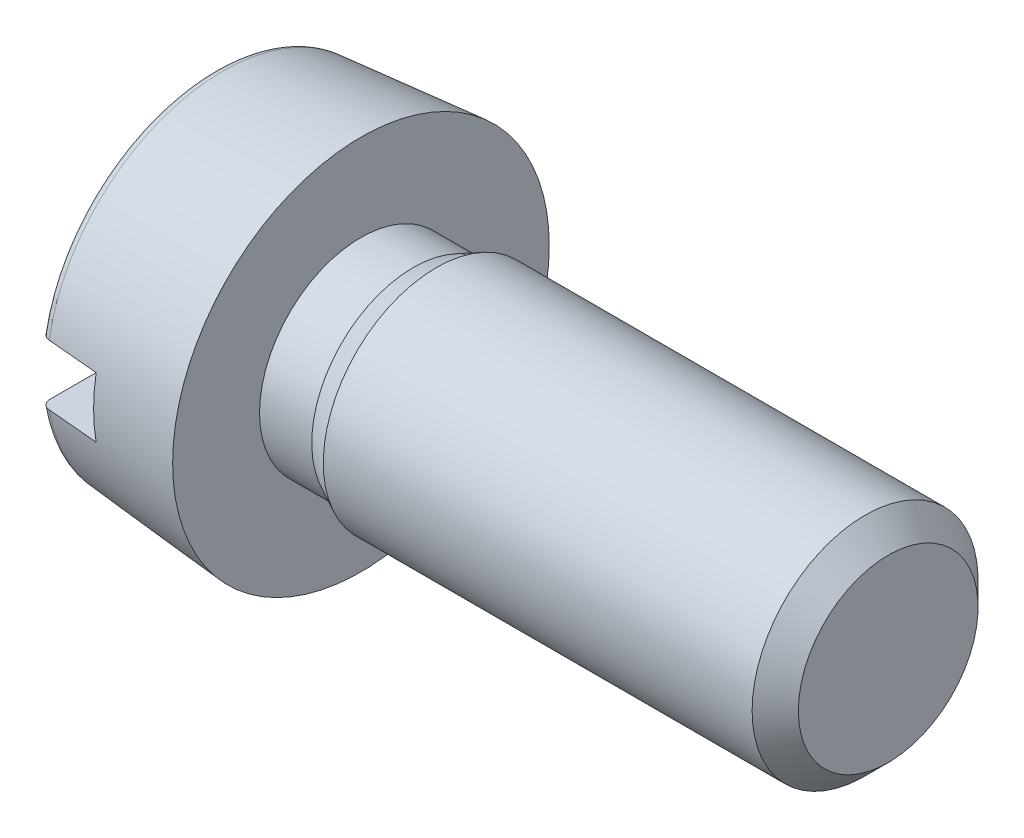
ISO-10303-21;
HEADER;
FILE_DESCRIPTION(('STEP AP214'),'2;1');
FILE_NAME('part.step','',(''),(''),'','','');
FILE_SCHEMA(('AUTOMOTIVE_DESIGN { 1 0 10303 214 1 1 1 1 }'));
ENDSEC;
DATA;
#1=APPLICATION_CONTEXT('core data for automotive mechanical design processes');
#2=APPLICATION_PROTOCOL_DEFINITION('international standard','automotive_design',2000,#1);
#3=PRODUCT_CONTEXT('',#1,'mechanical');
#4=PRODUCT('Part','Part','',(#3));
#5=PRODUCT_RELATED_PRODUCT_CATEGORY('part','',(#4));
#6=PRODUCT_DEFINITION_FORMATION('','',#4);
#7=PRODUCT_DEFINITION_CONTEXT('part definition',#1,'design');
#8=PRODUCT_DEFINITION('design','',#6,#7);
#9=PRODUCT_DEFINITION_SHAPE('','',#8);
#10=(LENGTH_UNIT() NAMED_UNIT(*) SI_UNIT(.MILLI.,.METRE.));
#11=(NAMED_UNIT(*) PLANE_ANGLE_UNIT() SI_UNIT($,.RADIAN.));
#12=(NAMED_UNIT(*) SI_UNIT($,.STERADIAN.) SOLID_ANGLE_UNIT());
#13=UNCERTAINTY_MEASURE_WITH_UNIT(LENGTH_MEASURE(1.E-05),#10,'distance_accuracy_value','');
#14=(GEOMETRIC_REPRESENTATION_CONTEXT(3) GLOBAL_UNCERTAINTY_ASSIGNED_CONTEXT((#13)) GLOBAL_UNIT_ASSIGNED_CONTEXT((#10,
#11,#12)) REPRESENTATION_CONTEXT('',''));
#15=CARTESIAN_POINT('',(0.,0.,0.));
#16=DIRECTION('',(0.,0.,1.));
#17=DIRECTION('',(1.,0.,0.));
#18=AXIS2_PLACEMENT_3D('',#15,#16,#17);
#19=CARTESIAN_POINT('',(14.,1.5,0.));
#20=DIRECTION('',(1.,0.,0.));
#21=DIRECTION('',(0.,0.,-1.));
#22=AXIS2_PLACEMENT_3D('',#19,#20,#21);
#23=PLANE('',#22);
#24=CARTESIAN_POINT('',(14.0000000002942,0.,0.));
#25=DIRECTION('',(-1.,0.,0.));
#26=DIRECTION('',(0.,0.,1.));
#27=AXIS2_PLACEMENT_3D('',#24,#25,#26);
#28=CIRCLE('',#27,2.3865500002671);
#29=CARTESIAN_POINT('',(14.0000000002942,0.,2.3865500002671));
#30=VERTEX_POINT('',#29);
#31=EDGE_CURVE('E21',#30,#30,#28,.T.);
#32=ORIENTED_EDGE('',*,*,#31,.F.);
#33=EDGE_LOOP('',(#32));
#34=FACE_BOUND('',#33,.T.);
#35=ADVANCED_FACE('F16',(#34),#23,.T.);
#36=CARTESIAN_POINT('',(13.3864499997003,0.,0.));
#37=DIRECTION('',(-1.,0.,0.));
#38=DIRECTION('',(0.,0.,1.));
#39=AXIS2_PLACEMENT_3D('',#36,#37,#38);
#40=CONICAL_SURFACE('',#39,2.99999999975853,0.785316662906592);
#41=ORIENTED_EDGE('',*,*,#31,.T.);
#42=EDGE_LOOP('',(#41));
#43=FACE_BOUND('',#42,.T.);
#44=CARTESIAN_POINT('',(13.38645,0.,0.));
#45=DIRECTION('',(1.,0.,0.));
#46=DIRECTION('',(0.,1.,0.));
#47=AXIS2_PLACEMENT_3D('',#44,#45,#46);
#48=CIRCLE('',#47,3.);
#49=CARTESIAN_POINT('',(13.38645,3.,0.));
#50=VERTEX_POINT('',#49);
#51=EDGE_CURVE('E330',#50,#50,#48,.F.);
#52=ORIENTED_EDGE('',*,*,#51,.F.);
#53=EDGE_LOOP('',(#52));
#54=FACE_BOUND('',#53,.T.);
#55=ADVANCED_FACE('F301',(#43,#54),#40,.T.);
#56=CARTESIAN_POINT('',(-2.3,0.,0.));
#57=DIRECTION('',(1.,0.,0.));
#58=DIRECTION('',(0.,0.,-1.));
#59=AXIS2_PLACEMENT_3D('',#56,#57,#58);
#60=PLANE('',#59);
#61=DIRECTION('',(0.,0.,1.));
#62=VECTOR('',#61,1.);
#63=CARTESIAN_POINT('',(-2.3,0.8,0.));
#64=LINE('',#63,#62);
#65=CARTESIAN_POINT('',(-2.29999999999572,0.8,4.73162253436084));
#66=VERTEX_POINT('',#65);
#67=CARTESIAN_POINT('',(-2.29999999999555,0.8,-4.73162253436085));
#68=VERTEX_POINT('',#67);
#69=EDGE_CURVE('E87',#66,#68,#64,.F.);
#70=ORIENTED_EDGE('',*,*,#69,.T.);
#71=CARTESIAN_POINT('',(-2.29999999999109,0.,0.));
#72=DIRECTION('',(1.,0.,0.));
#73=DIRECTION('',(0.,0.,-1.));
#74=AXIS2_PLACEMENT_3D('',#71,#72,#73);
#75=CIRCLE('',#74,4.79877607392501);
#76=CARTESIAN_POINT('',(-2.29999999999587,-0.8,-4.73162253436082));
#77=VERTEX_POINT('',#76);
#78=EDGE_CURVE('E73',#77,#68,#75,.T.);
#79=ORIENTED_EDGE('',*,*,#78,.F.);
#80=DIRECTION('',(0.,0.,-1.));
#81=VECTOR('',#80,1.);
#82=CARTESIAN_POINT('',(-2.3,-0.8,0.));
#83=LINE('',#82,#81);
#84=CARTESIAN_POINT('',(-2.29999999999555,-0.8,4.73162253436085));
#85=VERTEX_POINT('',#84);
#86=EDGE_CURVE('E79',#77,#85,#83,.F.);
#87=ORIENTED_EDGE('',*,*,#86,.T.);
#88=CARTESIAN_POINT('',(-2.29999999999109,0.,0.));
#89=DIRECTION('',(1.,0.,0.));
#90=DIRECTION('',(0.,0.,-1.));
#91=AXIS2_PLACEMENT_3D('',#88,#89,#90);
#92=CIRCLE('',#91,4.79877607392501);
#93=EDGE_CURVE('E89',#66,#85,#92,.T.);
#94=ORIENTED_EDGE('',*,*,#93,.F.);
#95=EDGE_LOOP('',(#70,#79,#87,#94));
#96=FACE_BOUND('',#95,.T.);
#97=ADVANCED_FACE('F84',(#96),#60,.F.);
#98=CARTESIAN_POINT('',(2.,0.,0.));
#99=DIRECTION('',(1.,0.,0.));
#100=DIRECTION('',(0.,0.,-1.));
#101=AXIS2_PLACEMENT_3D('',#98,#99,#100);
#102=CYLINDRICAL_SURFACE('',#101,3.);
#103=ORIENTED_EDGE('',*,*,#51,.T.);
#104=EDGE_LOOP('',(#103));
#105=FACE_BOUND('',#104,.T.);
#106=CARTESIAN_POINT('',(2.00000000006639,0.,0.));
#107=DIRECTION('',(1.,0.,0.));
#108=DIRECTION('',(0.,1.,0.));
#109=AXIS2_PLACEMENT_3D('',#106,#107,#108);
#110=CIRCLE('',#109,2.9999999998438);
#111=CARTESIAN_POINT('',(2.00000000006639,2.9999999998438,0.));
#112=VERTEX_POINT('',#111);
#113=EDGE_CURVE('E108',#112,#112,#110,.F.);
#114=ORIENTED_EDGE('',*,*,#113,.F.);
#115=EDGE_LOOP('',(#114));
#116=FACE_BOUND('',#115,.T.);
#117=ADVANCED_FACE('F285',(#105,#116),#102,.T.);
#118=CARTESIAN_POINT('',(-3.9,-0.8,0.));
#119=DIRECTION('',(0.,-1.,0.));
#120=DIRECTION('',(0.,0.,-1.));
#121=AXIS2_PLACEMENT_3D('',#118,#119,#120);
#122=PLANE('',#121);
#123=ORIENTED_EDGE('',*,*,#86,.F.);
#124=CARTESIAN_POINT('',(-3.67178893570228,-0.799999999955205,-4.6098585674175));
#125=CARTESIAN_POINT('',(-3.44315811048922,-0.799999999977603,-4.63016004331423));
#126=CARTESIAN_POINT('',(-3.21452695324051,-0.799999999992534,-4.65045777850787));
#127=CARTESIAN_POINT('',(-2.7572639746733,-0.800000000007466,-4.69104576748884));
#128=CARTESIAN_POINT('',(-2.52863215335481,-0.800000000007466,-4.71133602127616));
#129=CARTESIAN_POINT('',(-2.30000000000065,-0.8,-4.7316225343604));
#130=B_SPLINE_CURVE_WITH_KNOTS('',3,(#124,#125,#126,#127,#128,#129),.UNSPECIFIED.,.F.,.F.,(4,2,
4),(0.,0.688591197351455,1.37718239469824),.UNSPECIFIED.);
#131=CARTESIAN_POINT('',(-3.67178893570474,-0.8,-4.60985856737079));
#132=VERTEX_POINT('',#131);
#133=EDGE_CURVE('E70',#132,#77,#130,.T.);
#134=ORIENTED_EDGE('',*,*,#133,.F.);
#135=CARTESIAN_POINT('',(-3.9,-0.8,-4.35687310503253));
#136=CARTESIAN_POINT('',(-3.90001124697907,-0.800000000000965,-4.37133078213876));
#137=CARTESIAN_POINT('',(-3.89878738165529,-0.800000000000567,-4.38578661641532));
#138=CARTESIAN_POINT('',(-3.89394781162481,-0.799999999999433,-4.41428920557846));
#139=CARTESIAN_POINT('',(-3.89033263221283,-0.799999999998699,-4.4283360495997));
#140=CARTESIAN_POINT('',(-3.88078547572103,-0.799999999999284,-4.4556313448393));
#141=CARTESIAN_POINT('',(-3.87485190791473,-0.800000000000604,-4.46887924065174));
#142=CARTESIAN_POINT('',(-3.86082946208401,-0.799999999999396,-4.49417471750324));
#143=CARTESIAN_POINT('',(-3.85274143561821,-0.799999999996868,-4.50622277020593));
#144=CARTESIAN_POINT('',(-3.83470143856619,-0.799999999997456,-4.52867148838206));
#145=CARTESIAN_POINT('',(-3.82476510977585,-0.800000000000526,-4.53908471682223));
#146=CARTESIAN_POINT('',(-3.80326192452807,-0.799999999999475,-4.55806323026039));
#147=CARTESIAN_POINT('',(-3.79169527994834,-0.799999999995354,-4.5666287550226));
#148=CARTESIAN_POINT('',(-3.76743805113127,-0.79999999999555,-4.58153888361019));
#149=CARTESIAN_POINT('',(-3.75476589151611,-0.799999999999747,-4.58791347741107));
#150=CARTESIAN_POINT('',(-3.72853706379156,-0.800000000000253,-4.59840081845134));
#151=CARTESIAN_POINT('',(-3.7149818144123,-0.799999999996574,-4.60251709820573));
#152=CARTESIAN_POINT('',(-3.69148118647974,-0.799999999994965,-4.60751110246647));
#153=CARTESIAN_POINT('',(-3.6816599067324,-0.79999999999565,-4.60898768051533));
#154=CARTESIAN_POINT('',(-3.6717889356903,-0.8,-4.60985856728268));
#155=B_SPLINE_CURVE_WITH_KNOTS('',3,(#135,#136,#137,#138,#139,#140,#141,#142,#143,#144,#145,
#146,#147,#148,#149,#150,#151,#152,#153,#154),.UNSPECIFIED.,.F.,.F.,(4,2,2,2,2,2,2,2,2,4),(0.,
0.0433189549803674,0.0866283973394895,0.129967608136525,0.173289714285573,0.216260624886121,
0.259225956078385,0.301577266363726,0.34386213933544,0.373583309733058),.UNSPECIFIED.);
#156=CARTESIAN_POINT('',(-3.9,-0.8,-4.35687310503253));
#157=VERTEX_POINT('',#156);
#158=EDGE_CURVE('E80',#157,#132,#155,.T.);
#159=ORIENTED_EDGE('',*,*,#158,.F.);
#160=DIRECTION('',(0.,0.,1.));
#161=VECTOR('',#160,1.);
#162=CARTESIAN_POINT('',(-3.9,-0.8,0.));
#163=LINE('',#162,#161);
#164=CARTESIAN_POINT('',(-3.9,-0.8,4.35687310503253));
#165=VERTEX_POINT('',#164);
#166=EDGE_CURVE('E192',#165,#157,#163,.F.);
#167=ORIENTED_EDGE('',*,*,#166,.F.);
#168=CARTESIAN_POINT('',(-3.6717889356903,-0.8,4.60985856728268));
#169=CARTESIAN_POINT('',(-3.68567693970012,-0.8,4.60863811961262));
#170=CARTESIAN_POINT('',(-3.69945288025415,-0.8,4.60621503990569));
#171=CARTESIAN_POINT('',(-3.72638782755891,-0.8,4.59909736453629));
#172=CARTESIAN_POINT('',(-3.73954756212434,-0.8,4.59440552678679));
#173=CARTESIAN_POINT('',(-3.76489654802843,-0.8,4.58287878616229));
#174=CARTESIAN_POINT('',(-3.77708551072919,-0.800000000000001,4.57604324886569));
#175=CARTESIAN_POINT('',(-3.80015295142915,-0.799999999999999,4.5604394196599));
#176=CARTESIAN_POINT('',(-3.81103155338572,-0.799999999999998,4.55167131079035));
#177=CARTESIAN_POINT('',(-3.83126562558237,-0.800000000000002,4.53238362711617));
#178=CARTESIAN_POINT('',(-3.84060882263901,-0.800000000000008,4.52185118148821));
#179=CARTESIAN_POINT('',(-3.85742545445143,-0.799999999999992,4.49938607539448));
#180=CARTESIAN_POINT('',(-3.86489864570842,-0.799999999999972,4.4874532328759));
#181=CARTESIAN_POINT('',(-3.87788368047974,-0.800000000000029,4.46233244085502));
#182=CARTESIAN_POINT('',(-3.88336380871488,-0.800000000000108,4.44912809894919));
#183=CARTESIAN_POINT('',(-3.89205426176575,-0.799999999999892,4.42200849875324));
#184=CARTESIAN_POINT('',(-3.89526702873069,-0.799999999999596,4.40809402272224));
#185=CARTESIAN_POINT('',(-3.89910543098033,-0.799999999999427,4.38171679085161));
#186=CARTESIAN_POINT('',(-3.90000748384035,-0.799999999999505,4.3692937063793));
#187=CARTESIAN_POINT('',(-3.9,-0.8,4.35687310503253));
#188=B_SPLINE_CURVE_WITH_KNOTS('',3,(#168,#169,#170,#171,#172,#173,#174,#175,#176,#177,#178,
#179,#180,#181,#182,#183,#184,#185,#186,#187),.UNSPECIFIED.,.F.,.F.,(4,2,2,2,2,2,2,2,2,4),(0.,
0.0417656663579202,0.0834806893224071,0.125208069394316,0.166931499038194,0.208973732174627,
0.251021436904557,0.293711650858471,0.336355813197568,0.373592096231709),.UNSPECIFIED.);
#189=CARTESIAN_POINT('',(-3.67178893571239,-0.8,4.60985856745699));
#190=VERTEX_POINT('',#189);
#191=EDGE_CURVE('E180',#190,#165,#188,.T.);
#192=ORIENTED_EDGE('',*,*,#191,.F.);
#193=CARTESIAN_POINT('',(-2.2999999999998,-0.799999999992751,4.73162253435432));
#194=CARTESIAN_POINT('',(-2.52863215335372,-0.799999999996375,4.71133602126687));
#195=CARTESIAN_POINT('',(-2.75726397467244,-0.799999999998792,4.69104576748157));
#196=CARTESIAN_POINT('',(-3.21452695324105,-0.800000000001208,4.65045777851516));
#197=CARTESIAN_POINT('',(-3.44315811049093,-0.800000000001208,4.63016004333404));
#198=CARTESIAN_POINT('',(-3.67178893570561,-0.8,4.60985856745507));
#199=B_SPLINE_CURVE_WITH_KNOTS('',3,(#193,#194,#195,#196,#197,#198),.UNSPECIFIED.,.F.,.F.,(4,2,
4),(0.,0.688591197346941,1.37718239469855),.UNSPECIFIED.);
#200=EDGE_CURVE('E92',#85,#190,#199,.T.);
#201=ORIENTED_EDGE('',*,*,#200,.F.);
#202=EDGE_LOOP('',(#123,#134,#159,#167,#192,#201));
#203=FACE_BOUND('',#202,.T.);
#204=ADVANCED_FACE('F90',(#203),#122,.F.);
#205=CARTESIAN_POINT('',(-3.9,0.8,0.));
#206=DIRECTION('',(0.,1.,0.));
#207=DIRECTION('',(0.,0.,1.));
#208=AXIS2_PLACEMENT_3D('',#205,#206,#207);
#209=PLANE('',#208);
#210=CARTESIAN_POINT('',(-3.9,0.8,4.35687310503253));
#211=CARTESIAN_POINT('',(-3.90001124697906,0.800000000000967,4.37133078213876));
#212=CARTESIAN_POINT('',(-3.89878738165529,0.800000000000568,4.38578661641532));
#213=CARTESIAN_POINT('',(-3.89394781162481,0.799999999999432,4.41428920557846));
#214=CARTESIAN_POINT('',(-3.89033263221283,0.799999999998697,4.4283360495997));
#215=CARTESIAN_POINT('',(-3.88078547572103,0.799999999999282,4.4556313448393));
#216=CARTESIAN_POINT('',(-3.87485190791473,0.800000000000604,4.46887924065174));
#217=CARTESIAN_POINT('',(-3.86082946208401,0.799999999999396,4.49417471750324));
#218=CARTESIAN_POINT('',(-3.85274143561821,0.799999999996866,4.50622277020592));
#219=CARTESIAN_POINT('',(-3.8347014385662,0.799999999997453,4.52867148838205));
#220=CARTESIAN_POINT('',(-3.82476510977585,0.800000000000524,4.53908471682223));
#221=CARTESIAN_POINT('',(-3.80326192452807,0.799999999999476,4.55806323026039));
#222=CARTESIAN_POINT('',(-3.79169527994834,0.799999999995357,4.5666287550226));
#223=CARTESIAN_POINT('',(-3.76743805113127,0.799999999995553,4.58153888361019));
#224=CARTESIAN_POINT('',(-3.75476589151611,0.799999999999748,4.58791347741107));
#225=CARTESIAN_POINT('',(-3.72853706379156,0.800000000000252,4.59840081845134));
#226=CARTESIAN_POINT('',(-3.7149818144123,0.799999999996573,4.60251709820573));
#227=CARTESIAN_POINT('',(-3.69148118647974,0.799999999994964,4.60751110246647));
#228=CARTESIAN_POINT('',(-3.6816599067324,0.79999999999565,4.60898768051533));
#229=CARTESIAN_POINT('',(-3.6717889356903,0.8,4.60985856728268));
#230=B_SPLINE_CURVE_WITH_KNOTS('',3,(#210,#211,#212,#213,#214,#215,#216,#217,#218,#219,#220,
#221,#222,#223,#224,#225,#226,#227,#228,#229),.UNSPECIFIED.,.F.,.F.,(4,2,2,2,2,2,2,2,2,4),(0.,
0.0433189549803683,0.0866283973394883,0.129967608136519,0.173289714285563,0.216260624886116,
0.259225956078385,0.301577266363726,0.34386213933544,0.373583309733059),.UNSPECIFIED.);
#231=CARTESIAN_POINT('',(-3.9,0.8,4.35687310503253));
#232=VERTEX_POINT('',#231);
#233=CARTESIAN_POINT('',(-3.67178893570474,0.8,4.60985856737079));
#234=VERTEX_POINT('',#233);
#235=EDGE_CURVE('E109',#232,#234,#230,.T.);
#236=ORIENTED_EDGE('',*,*,#235,.F.);
#237=DIRECTION('',(0.,0.,1.));
#238=VECTOR('',#237,1.);
#239=CARTESIAN_POINT('',(-3.9,0.8,0.));
#240=LINE('',#239,#238);
#241=CARTESIAN_POINT('',(-3.9,0.8,-4.35687310503253));
#242=VERTEX_POINT('',#241);
#243=EDGE_CURVE('E187',#242,#232,#240,.T.);
#244=ORIENTED_EDGE('',*,*,#243,.F.);
#245=CARTESIAN_POINT('',(-3.6717889356903,0.8,-4.60985856728268));
#246=CARTESIAN_POINT('',(-3.68567693970012,0.8,-4.60863811961262));
#247=CARTESIAN_POINT('',(-3.69945288025415,0.8,-4.60621503990569));
#248=CARTESIAN_POINT('',(-3.72638782755891,0.8,-4.59909736453629));
#249=CARTESIAN_POINT('',(-3.73954756212434,0.8,-4.59440552678679));
#250=CARTESIAN_POINT('',(-3.76489654802843,0.8,-4.58287878616229));
#251=CARTESIAN_POINT('',(-3.77708551072919,0.800000000000001,-4.57604324886569));
#252=CARTESIAN_POINT('',(-3.80015295142915,0.799999999999999,-4.5604394196599));
#253=CARTESIAN_POINT('',(-3.81103155338572,0.799999999999998,-4.55167131079035));
#254=CARTESIAN_POINT('',(-3.83126562558237,0.800000000000002,-4.53238362711617));
#255=CARTESIAN_POINT('',(-3.84060882263901,0.800000000000008,-4.52185118148821));
#256=CARTESIAN_POINT('',(-3.85742545445143,0.799999999999992,-4.49938607539448));
#257=CARTESIAN_POINT('',(-3.86489864570842,0.799999999999972,-4.4874532328759));
#258=CARTESIAN_POINT('',(-3.87788368047974,0.800000000000029,-4.46233244085502));
#259=CARTESIAN_POINT('',(-3.88336380871488,0.800000000000108,-4.44912809894919));
#260=CARTESIAN_POINT('',(-3.89205426176575,0.799999999999892,-4.42200849875324));
#261=CARTESIAN_POINT('',(-3.89526702873069,0.799999999999597,-4.40809402272224));
#262=CARTESIAN_POINT('',(-3.89910543098033,0.799999999999428,-4.3817167908516));
#263=CARTESIAN_POINT('',(-3.90000748384035,0.799999999999506,-4.3692937063793));
#264=CARTESIAN_POINT('',(-3.9,0.8,-4.35687310503253));
#265=B_SPLINE_CURVE_WITH_KNOTS('',3,(#245,#246,#247,#248,#249,#250,#251,#252,#253,#254,#255,
#256,#257,#258,#259,#260,#261,#262,#263,#264),.UNSPECIFIED.,.F.,.F.,(4,2,2,2,2,2,2,2,2,4),(0.,
0.0417656663579202,0.0834806893224071,0.125208069394316,0.166931499038194,0.208973732174627,
0.251021436904557,0.293711650858471,0.336355813197568,0.373592096231715),.UNSPECIFIED.);
#266=CARTESIAN_POINT('',(-3.67178893571239,0.8,-4.60985856745699));
#267=VERTEX_POINT('',#266);
#268=EDGE_CURVE('E36',#267,#242,#265,.T.);
#269=ORIENTED_EDGE('',*,*,#268,.F.);
#270=CARTESIAN_POINT('',(-2.3,0.799999999991019,-4.73162253435283));
#271=CARTESIAN_POINT('',(-2.52863215335393,0.79999999999551,-4.71133602126611));
#272=CARTESIAN_POINT('',(-2.75726397467264,0.799999999998503,-4.69104576748131));
#273=CARTESIAN_POINT('',(-3.21452695324118,0.800000000001497,-4.65045777851539));
#274=CARTESIAN_POINT('',(-3.443158110491,0.800000000001497,-4.63016004333427));
#275=CARTESIAN_POINT('',(-3.67178893570561,0.8,-4.60985856745507));
#276=B_SPLINE_CURVE_WITH_KNOTS('',3,(#270,#271,#272,#273,#274,#275),.UNSPECIFIED.,.F.,.F.,(4,2,
4),(0.,0.688591197346775,1.37718239469822),.UNSPECIFIED.);
#277=EDGE_CURVE('E136',#68,#267,#276,.T.);
#278=ORIENTED_EDGE('',*,*,#277,.F.);
#279=ORIENTED_EDGE('',*,*,#69,.F.);
#280=CARTESIAN_POINT('',(-3.67178893570228,0.799999999955205,4.6098585674175));
#281=CARTESIAN_POINT('',(-3.44315811048917,0.799999999977603,4.63016004331423));
#282=CARTESIAN_POINT('',(-3.2145269532404,0.799999999992534,4.65045777850788));
#283=CARTESIAN_POINT('',(-2.75726397467309,0.800000000007466,4.69104576748886));
#284=CARTESIAN_POINT('',(-2.52863215335455,0.800000000007466,4.71133602127619));
#285=CARTESIAN_POINT('',(-2.30000000000034,0.8,4.73162253436043));
#286=B_SPLINE_CURVE_WITH_KNOTS('',3,(#280,#281,#282,#283,#284,#285),.UNSPECIFIED.,.F.,.F.,(4,2,
4),(0.,0.688591197351613,1.37718239469856),.UNSPECIFIED.);
#287=EDGE_CURVE('E102',#234,#66,#286,.T.);
#288=ORIENTED_EDGE('',*,*,#287,.F.);
#289=EDGE_LOOP('',(#236,#244,#269,#278,#279,#288));
#290=FACE_BOUND('',#289,.T.);
#291=ADVANCED_FACE('F111',(#290),#209,.F.);
#292=CARTESIAN_POINT('',(1.99999999989587,0.,0.));
#293=DIRECTION('',(1.,0.,0.));
#294=DIRECTION('',(0.,0.,-1.));
#295=AXIS2_PLACEMENT_3D('',#292,#293,#294);
#296=CONICAL_SURFACE('',#295,2.99999999975853,0.463615010744495);
#297=CARTESIAN_POINT('',(1.38645,0.,0.));
#298=DIRECTION('',(1.,0.,0.));
#299=DIRECTION('',(0.,1.,0.));
#300=AXIS2_PLACEMENT_3D('',#297,#298,#299);
#301=CIRCLE('',#300,2.69325);
#302=CARTESIAN_POINT('',(1.38645,2.69325,0.));
#303=VERTEX_POINT('',#302);
#304=EDGE_CURVE('E185',#303,#303,#301,.F.);
#305=ORIENTED_EDGE('',*,*,#304,.F.);
#306=EDGE_LOOP('',(#305));
#307=FACE_BOUND('',#306,.T.);
#308=ORIENTED_EDGE('',*,*,#113,.T.);
#309=EDGE_LOOP('',(#308));
#310=FACE_BOUND('',#309,.T.);
#311=ADVANCED_FACE('F116',(#307,#310),#296,.T.);
#312=CARTESIAN_POINT('',(-3.9,2.32939710612445,0.));
#313=DIRECTION('',(-1.,0.,0.));
#314=DIRECTION('',(0.,0.,1.));
#315=AXIS2_PLACEMENT_3D('',#312,#313,#314);
#316=PLANE('',#315);
#317=ORIENTED_EDGE('',*,*,#166,.T.);
#318=CARTESIAN_POINT('',(-3.9,0.,0.));
#319=DIRECTION('',(1.,0.,0.));
#320=DIRECTION('',(0.,-0.180598672097411,0.983556871582244));
#321=AXIS2_PLACEMENT_3D('',#318,#319,#320);
#322=CIRCLE('',#321,4.42971141874454);
#323=EDGE_CURVE('E172',#165,#157,#322,.T.);
#324=ORIENTED_EDGE('',*,*,#323,.F.);
#325=EDGE_LOOP('',(#317,#324));
#326=FACE_BOUND('',#325,.T.);
#327=ADVANCED_FACE('F212',(#326),#316,.T.);
#328=CARTESIAN_POINT('',(-3.9,2.32939710612445,0.));
#329=DIRECTION('',(-1.,0.,0.));
#330=DIRECTION('',(0.,0.,1.));
#331=AXIS2_PLACEMENT_3D('',#328,#329,#330);
#332=PLANE('',#331);
#333=ORIENTED_EDGE('',*,*,#243,.T.);
#334=CARTESIAN_POINT('',(-3.9,0.,0.));
#335=DIRECTION('',(1.,0.,0.));
#336=DIRECTION('',(0.,0.18059867209741,-0.983556871582245));
#337=AXIS2_PLACEMENT_3D('',#334,#335,#336);
#338=CIRCLE('',#337,4.42971141874454);
#339=EDGE_CURVE('E101',#242,#232,#338,.T.);
#340=ORIENTED_EDGE('',*,*,#339,.F.);
#341=EDGE_LOOP('',(#333,#340));
#342=FACE_BOUND('',#341,.T.);
#343=ADVANCED_FACE('F203',(#342),#332,.T.);
#344=CARTESIAN_POINT('',(0.,0.,0.));
#345=DIRECTION('',(1.,0.,0.));
#346=DIRECTION('',(0.,0.,-1.));
#347=AXIS2_PLACEMENT_3D('',#344,#345,#346);
#348=CYLINDRICAL_SURFACE('',#347,2.69325);
#349=CARTESIAN_POINT('',(0.,0.,0.));
#350=DIRECTION('',(1.,0.,0.));
#351=DIRECTION('',(0.,0.,-1.));
#352=AXIS2_PLACEMENT_3D('',#349,#350,#351);
#353=CIRCLE('',#352,2.69325);
#354=CARTESIAN_POINT('',(0.,0.,-2.69325));
#355=VERTEX_POINT('',#354);
#356=EDGE_CURVE('E98',#355,#355,#353,.F.);
#357=ORIENTED_EDGE('',*,*,#356,.F.);
#358=EDGE_LOOP('',(#357));
#359=FACE_BOUND('',#358,.T.);
#360=ORIENTED_EDGE('',*,*,#304,.T.);
#361=EDGE_LOOP('',(#360));
#362=FACE_BOUND('',#361,.T.);
#363=ADVANCED_FACE('F211',(#359,#362),#348,.T.);
#364=CARTESIAN_POINT('',(-3.65,0.,0.));
#365=DIRECTION('',(1.,0.,0.));
#366=DIRECTION('',(0.,0.,-1.));
#367=AXIS2_PLACEMENT_3D('',#364,#365,#366);
#368=TOROIDAL_SURFACE('',#367,4.42971141874454,0.25);
#369=ORIENTED_EDGE('',*,*,#158,.T.);
#370=CARTESIAN_POINT('',(-3.67178893571918,0.,0.));
#371=DIRECTION('',(1.,0.,0.));
#372=DIRECTION('',(0.,1.,0.));
#373=AXIS2_PLACEMENT_3D('',#370,#371,#372);
#374=CIRCLE('',#373,4.67876009344082);
#375=EDGE_CURVE('E76',#190,#132,#374,.T.);
#376=ORIENTED_EDGE('',*,*,#375,.F.);
#377=ORIENTED_EDGE('',*,*,#191,.T.);
#378=ORIENTED_EDGE('',*,*,#323,.T.);
#379=EDGE_LOOP('',(#369,#376,#377,#378));
#380=FACE_BOUND('',#379,.T.);
#381=ADVANCED_FACE('F146',(#380),#368,.T.);
#382=CARTESIAN_POINT('',(-3.65,0.,0.));
#383=DIRECTION('',(1.,0.,0.));
#384=DIRECTION('',(0.,0.,-1.));
#385=AXIS2_PLACEMENT_3D('',#382,#383,#384);
#386=TOROIDAL_SURFACE('',#385,4.42971141874454,0.25);
#387=ORIENTED_EDGE('',*,*,#268,.T.);
#388=ORIENTED_EDGE('',*,*,#339,.T.);
#389=ORIENTED_EDGE('',*,*,#235,.T.);
#390=CARTESIAN_POINT('',(-3.67178893571918,0.,0.));
#391=DIRECTION('',(1.,0.,0.));
#392=DIRECTION('',(0.,1.,0.));
#393=AXIS2_PLACEMENT_3D('',#390,#391,#392);
#394=CIRCLE('',#393,4.67876009344082);
#395=EDGE_CURVE('E27',#267,#234,#394,.T.);
#396=ORIENTED_EDGE('',*,*,#395,.F.);
#397=EDGE_LOOP('',(#387,#388,#389,#396));
#398=FACE_BOUND('',#397,.T.);
#399=ADVANCED_FACE('F140',(#398),#386,.T.);
#400=CARTESIAN_POINT('',(0.,3.846625,0.));
#401=DIRECTION('',(1.,0.,0.));
#402=DIRECTION('',(0.,0.,-1.));
#403=AXIS2_PLACEMENT_3D('',#400,#401,#402);
#404=PLANE('',#403);
#405=ORIENTED_EDGE('',*,*,#356,.T.);
#406=EDGE_LOOP('',(#405));
#407=FACE_BOUND('',#406,.T.);
#408=CARTESIAN_POINT('',(0.,0.,0.));
#409=DIRECTION('',(1.,0.,0.));
#410=DIRECTION('',(0.,0.,-1.));
#411=AXIS2_PLACEMENT_3D('',#408,#409,#410);
#412=CIRCLE('',#411,4.99999999980361);
#413=CARTESIAN_POINT('',(0.,0.,-4.99999999980361));
#414=VERTEX_POINT('',#413);
#415=EDGE_CURVE('E11',#414,#414,#412,.F.);
#416=ORIENTED_EDGE('',*,*,#415,.F.);
#417=EDGE_LOOP('',(#416));
#418=FACE_BOUND('',#417,.T.);
#419=ADVANCED_FACE('F145',(#407,#418),#404,.T.);
#420=CARTESIAN_POINT('',(0.,0.,0.));
#421=DIRECTION('',(1.,0.,0.));
#422=DIRECTION('',(0.,0.,-1.));
#423=AXIS2_PLACEMENT_3D('',#420,#421,#422);
#424=CONICAL_SURFACE('',#423,4.99999999980361,0.0872664625003674);
#425=ORIENTED_EDGE('',*,*,#415,.T.);
#426=EDGE_LOOP('',(#425));
#427=FACE_BOUND('',#426,.T.);
#428=ORIENTED_EDGE('',*,*,#287,.T.);
#429=ORIENTED_EDGE('',*,*,#93,.T.);
#430=ORIENTED_EDGE('',*,*,#200,.T.);
#431=ORIENTED_EDGE('',*,*,#375,.T.);
#432=ORIENTED_EDGE('',*,*,#133,.T.);
#433=ORIENTED_EDGE('',*,*,#78,.T.);
#434=ORIENTED_EDGE('',*,*,#277,.T.);
#435=ORIENTED_EDGE('',*,*,#395,.T.);
#436=EDGE_LOOP('',(#428,#429,#430,#431,#432,#433,#434,#435));
#437=FACE_BOUND('',#436,.T.);
#438=ADVANCED_FACE('F18',(#427,#437),#424,.T.);
#439=CLOSED_SHELL('',(#35,#55,#97,#117,#204,#291,#311,#327,#343,#363,#381,#399,#419,#438));
#440=MANIFOLD_SOLID_BREP('B1',#439);
#441=ADVANCED_BREP_SHAPE_REPRESENTATION('',(#18,#440),#14);
#442=SHAPE_DEFINITION_REPRESENTATION(#9,#441);
ENDSEC;
END-ISO-10303-21;
